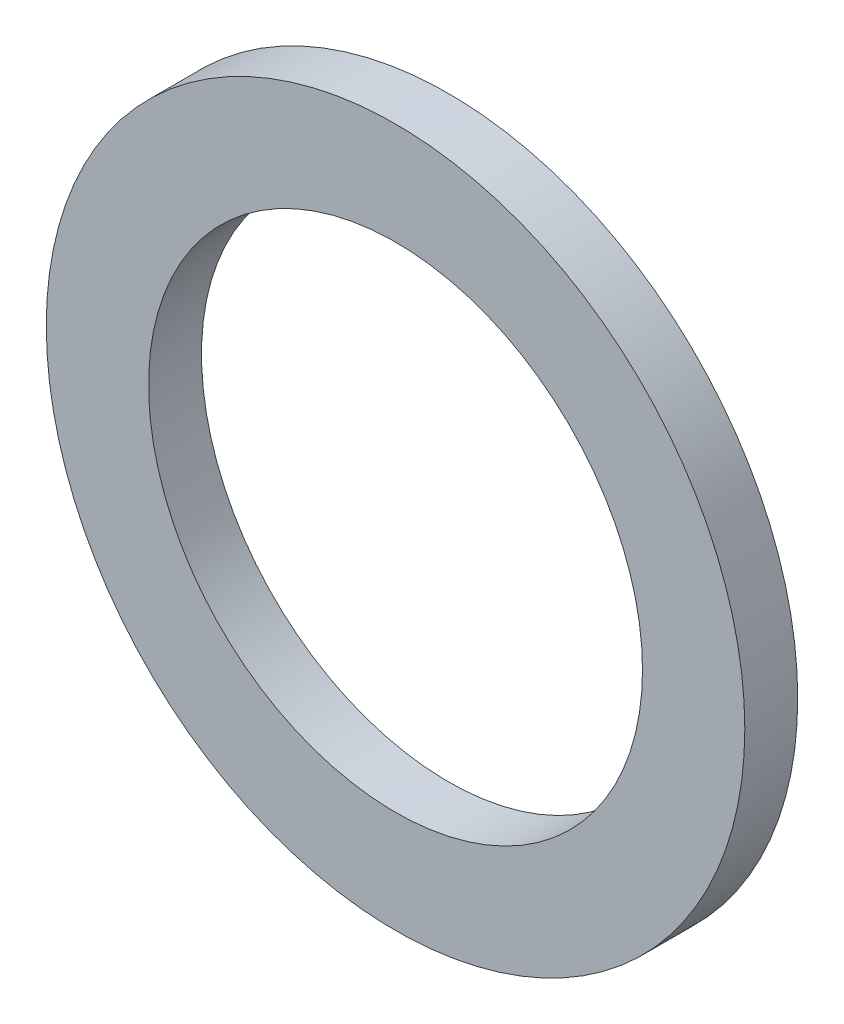
ISO-10303-21;
HEADER;
FILE_DESCRIPTION(('STEP AP214'),'2;1');
FILE_NAME('part.step','',(''),(''),'','','');
FILE_SCHEMA(('AUTOMOTIVE_DESIGN { 1 0 10303 214 1 1 1 1 }'));
ENDSEC;
DATA;
#1=APPLICATION_CONTEXT('core data for automotive mechanical design processes');
#2=APPLICATION_PROTOCOL_DEFINITION('international standard','automotive_design',2000,#1);
#3=PRODUCT_CONTEXT('',#1,'mechanical');
#4=PRODUCT('Part','Part','',(#3));
#5=PRODUCT_RELATED_PRODUCT_CATEGORY('part','',(#4));
#6=PRODUCT_DEFINITION_FORMATION('','',#4);
#7=PRODUCT_DEFINITION_CONTEXT('part definition',#1,'design');
#8=PRODUCT_DEFINITION('design','',#6,#7);
#9=PRODUCT_DEFINITION_SHAPE('','',#8);
#10=(LENGTH_UNIT() NAMED_UNIT(*) SI_UNIT(.MILLI.,.METRE.));
#11=(NAMED_UNIT(*) PLANE_ANGLE_UNIT() SI_UNIT($,.RADIAN.));
#12=(NAMED_UNIT(*) SI_UNIT($,.STERADIAN.) SOLID_ANGLE_UNIT());
#13=UNCERTAINTY_MEASURE_WITH_UNIT(LENGTH_MEASURE(1.E-05),#10,'distance_accuracy_value','');
#14=(GEOMETRIC_REPRESENTATION_CONTEXT(3) GLOBAL_UNCERTAINTY_ASSIGNED_CONTEXT((#13)) GLOBAL_UNIT_ASSIGNED_CONTEXT((#10,
#11,#12)) REPRESENTATION_CONTEXT('',''));
#15=CARTESIAN_POINT('',(0.,0.,0.));
#16=DIRECTION('',(0.,0.,1.));
#17=DIRECTION('',(1.,0.,0.));
#18=AXIS2_PLACEMENT_3D('',#15,#16,#17);
#19=CARTESIAN_POINT('',(0.,0.,1.5));
#20=DIRECTION('',(0.,0.,1.));
#21=DIRECTION('',(1.,0.,0.));
#22=AXIS2_PLACEMENT_3D('',#19,#20,#21);
#23=PLANE('',#22);
#24=CARTESIAN_POINT('',(0.,0.,1.5));
#25=DIRECTION('',(0.,0.,1.));
#26=DIRECTION('',(1.,0.,0.));
#27=AXIS2_PLACEMENT_3D('',#24,#25,#26);
#28=CIRCLE('',#27,9.9);
#29=CARTESIAN_POINT('',(9.9,0.,1.5));
#30=VERTEX_POINT('',#29);
#31=EDGE_CURVE('E10',#30,#30,#28,.T.);
#32=ORIENTED_EDGE('',*,*,#31,.T.);
#33=EDGE_LOOP('',(#32));
#34=FACE_BOUND('',#33,.T.);
#35=CARTESIAN_POINT('',(0.,0.,1.5));
#36=DIRECTION('',(0.,0.,1.));
#37=DIRECTION('',(1.,0.,0.));
#38=AXIS2_PLACEMENT_3D('',#35,#36,#37);
#39=CIRCLE('',#38,7.);
#40=CARTESIAN_POINT('',(7.,0.,1.5));
#41=VERTEX_POINT('',#40);
#42=EDGE_CURVE('E42',#41,#41,#39,.T.);
#43=ORIENTED_EDGE('',*,*,#42,.F.);
#44=EDGE_LOOP('',(#43));
#45=FACE_BOUND('',#44,.T.);
#46=ADVANCED_FACE('F31',(#34,#45),#23,.T.);
#47=CARTESIAN_POINT('',(0.,0.,0.));
#48=DIRECTION('',(0.,0.,1.));
#49=DIRECTION('',(1.,0.,0.));
#50=AXIS2_PLACEMENT_3D('',#47,#48,#49);
#51=PLANE('',#50);
#52=CARTESIAN_POINT('',(0.,0.,0.));
#53=DIRECTION('',(0.,0.,1.));
#54=DIRECTION('',(1.,0.,0.));
#55=AXIS2_PLACEMENT_3D('',#52,#53,#54);
#56=CIRCLE('',#55,9.9);
#57=CARTESIAN_POINT('',(9.9,0.,0.));
#58=VERTEX_POINT('',#57);
#59=EDGE_CURVE('E38',#58,#58,#56,.T.);
#60=ORIENTED_EDGE('',*,*,#59,.F.);
#61=EDGE_LOOP('',(#60));
#62=FACE_BOUND('',#61,.T.);
#63=CARTESIAN_POINT('',(0.,0.,0.));
#64=DIRECTION('',(0.,0.,1.));
#65=DIRECTION('',(1.,0.,0.));
#66=AXIS2_PLACEMENT_3D('',#63,#64,#65);
#67=CIRCLE('',#66,7.);
#68=CARTESIAN_POINT('',(7.,0.,0.));
#69=VERTEX_POINT('',#68);
#70=EDGE_CURVE('E46',#69,#69,#67,.T.);
#71=ORIENTED_EDGE('',*,*,#70,.T.);
#72=EDGE_LOOP('',(#71));
#73=FACE_BOUND('',#72,.T.);
#74=ADVANCED_FACE('F52',(#62,#73),#51,.F.);
#75=CARTESIAN_POINT('',(0.,0.,1.5));
#76=DIRECTION('',(0.,0.,-1.));
#77=DIRECTION('',(-1.,0.,0.));
#78=AXIS2_PLACEMENT_3D('',#75,#76,#77);
#79=CYLINDRICAL_SURFACE('',#78,9.9);
#80=ORIENTED_EDGE('',*,*,#31,.F.);
#81=EDGE_LOOP('',(#80));
#82=FACE_BOUND('',#81,.T.);
#83=ORIENTED_EDGE('',*,*,#59,.T.);
#84=EDGE_LOOP('',(#83));
#85=FACE_BOUND('',#84,.T.);
#86=ADVANCED_FACE('F33',(#82,#85),#79,.T.);
#87=CARTESIAN_POINT('',(0.,0.,1.5));
#88=DIRECTION('',(0.,0.,-1.));
#89=DIRECTION('',(-1.,0.,0.));
#90=AXIS2_PLACEMENT_3D('',#87,#88,#89);
#91=CYLINDRICAL_SURFACE('',#90,7.);
#92=ORIENTED_EDGE('',*,*,#42,.T.);
#93=EDGE_LOOP('',(#92));
#94=FACE_BOUND('',#93,.T.);
#95=ORIENTED_EDGE('',*,*,#70,.F.);
#96=EDGE_LOOP('',(#95));
#97=FACE_BOUND('',#96,.T.);
#98=ADVANCED_FACE('F54',(#94,#97),#91,.F.);
#99=CLOSED_SHELL('',(#46,#74,#86,#98));
#100=MANIFOLD_SOLID_BREP('B2',#99);
#101=ADVANCED_BREP_SHAPE_REPRESENTATION('',(#18,#100),#14);
#102=SHAPE_DEFINITION_REPRESENTATION(#9,#101);
ENDSEC;
END-ISO-10303-21;
